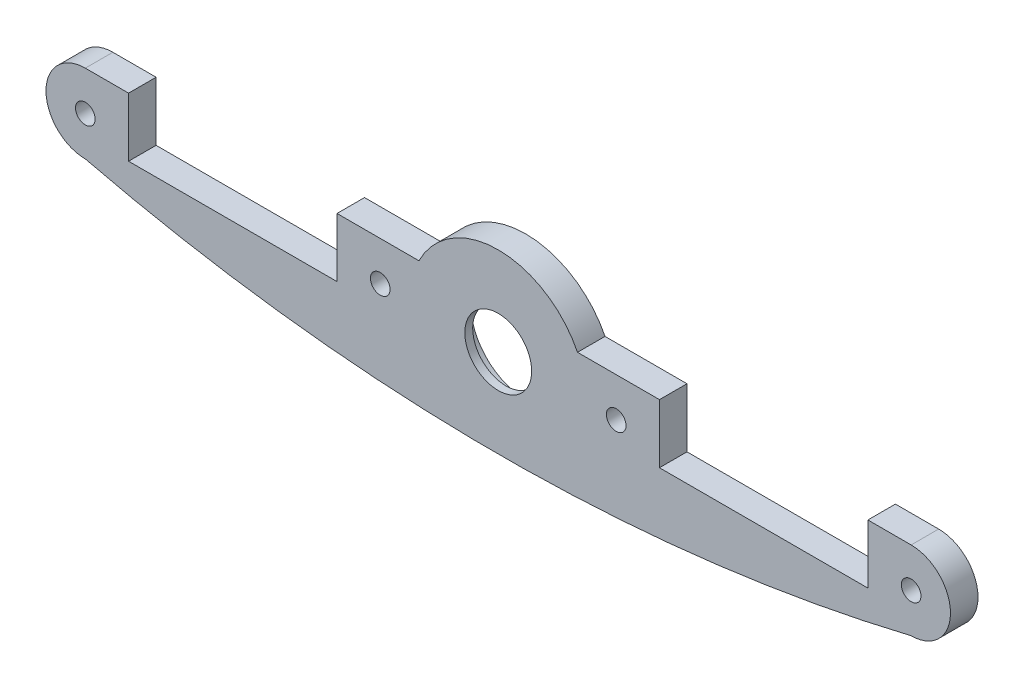
ISO-10303-21;
HEADER;
FILE_DESCRIPTION(('STEP AP214'),'2;1');
FILE_NAME('part.step','',(''),(''),'','','');
FILE_SCHEMA(('AUTOMOTIVE_DESIGN { 1 0 10303 214 1 1 1 1 }'));
ENDSEC;
DATA;
#1=APPLICATION_CONTEXT('core data for automotive mechanical design processes');
#2=APPLICATION_PROTOCOL_DEFINITION('international standard','automotive_design',2000,#1);
#3=PRODUCT_CONTEXT('',#1,'mechanical');
#4=PRODUCT('Part','Part','',(#3));
#5=PRODUCT_RELATED_PRODUCT_CATEGORY('part','',(#4));
#6=PRODUCT_DEFINITION_FORMATION('','',#4);
#7=PRODUCT_DEFINITION_CONTEXT('part definition',#1,'design');
#8=PRODUCT_DEFINITION('design','',#6,#7);
#9=PRODUCT_DEFINITION_SHAPE('','',#8);
#10=(LENGTH_UNIT() NAMED_UNIT(*) SI_UNIT(.MILLI.,.METRE.));
#11=(NAMED_UNIT(*) PLANE_ANGLE_UNIT() SI_UNIT($,.RADIAN.));
#12=(NAMED_UNIT(*) SI_UNIT($,.STERADIAN.) SOLID_ANGLE_UNIT());
#13=UNCERTAINTY_MEASURE_WITH_UNIT(LENGTH_MEASURE(1.E-05),#10,'distance_accuracy_value','');
#14=(GEOMETRIC_REPRESENTATION_CONTEXT(3) GLOBAL_UNCERTAINTY_ASSIGNED_CONTEXT((#13)) GLOBAL_UNIT_ASSIGNED_CONTEXT((#10,
#11,#12)) REPRESENTATION_CONTEXT('',''));
#15=CARTESIAN_POINT('',(0.,0.,0.));
#16=DIRECTION('',(0.,0.,1.));
#17=DIRECTION('',(1.,0.,0.));
#18=AXIS2_PLACEMENT_3D('',#15,#16,#17);
#19=CARTESIAN_POINT('',(0.,10.,-7.));
#20=DIRECTION('',(0.,1.,0.));
#21=DIRECTION('',(-1.,0.,0.));
#22=AXIS2_PLACEMENT_3D('',#19,#20,#21);
#23=PLANE('',#22);
#24=DIRECTION('',(0.,0.,-1.));
#25=VECTOR('',#24,1.);
#26=CARTESIAN_POINT('',(41.,10.,0.00100000000000013));
#27=LINE('',#26,#25);
#28=CARTESIAN_POINT('',(41.,10.,0.));
#29=VERTEX_POINT('',#28);
#30=CARTESIAN_POINT('',(41.,10.,-7.));
#31=VERTEX_POINT('',#30);
#32=EDGE_CURVE('E308',#29,#31,#27,.T.);
#33=ORIENTED_EDGE('',*,*,#32,.T.);
#34=DIRECTION('',(-1.,0.,0.));
#35=VECTOR('',#34,1.);
#36=CARTESIAN_POINT('',(0.,10.,-7.));
#37=LINE('',#36,#35);
#38=CARTESIAN_POINT('',(20.1556443707464,10.,-7.));
#39=VERTEX_POINT('',#38);
#40=EDGE_CURVE('E194',#31,#39,#37,.T.);
#41=ORIENTED_EDGE('',*,*,#40,.T.);
#42=DIRECTION('',(0.,0.,1.));
#43=VECTOR('',#42,1.);
#44=CARTESIAN_POINT('',(20.1556443707464,10.,-7.));
#45=LINE('',#44,#43);
#46=CARTESIAN_POINT('',(20.1556443707464,10.,0.));
#47=VERTEX_POINT('',#46);
#48=EDGE_CURVE('E12',#39,#47,#45,.T.);
#49=ORIENTED_EDGE('',*,*,#48,.T.);
#50=DIRECTION('',(-1.,0.,0.));
#51=VECTOR('',#50,1.);
#52=CARTESIAN_POINT('',(0.,10.,0.));
#53=LINE('',#52,#51);
#54=EDGE_CURVE('E217',#29,#47,#53,.T.);
#55=ORIENTED_EDGE('',*,*,#54,.F.);
#56=EDGE_LOOP('',(#33,#41,#49,#55));
#57=FACE_BOUND('',#56,.T.);
#58=ADVANCED_FACE('F61',(#57),#23,.T.);
#59=CARTESIAN_POINT('',(0.,10.,-7.));
#60=DIRECTION('',(0.,1.,0.));
#61=DIRECTION('',(-1.,0.,0.));
#62=AXIS2_PLACEMENT_3D('',#59,#60,#61);
#63=PLANE('',#62);
#64=DIRECTION('',(0.,0.,-1.));
#65=VECTOR('',#64,1.);
#66=CARTESIAN_POINT('',(-94.,10.,0.00100000000000013));
#67=LINE('',#66,#65);
#68=CARTESIAN_POINT('',(-94.,9.99999999999997,0.));
#69=VERTEX_POINT('',#68);
#70=CARTESIAN_POINT('',(-94.,10.,-7.));
#71=VERTEX_POINT('',#70);
#72=EDGE_CURVE('E297',#69,#71,#67,.T.);
#73=ORIENTED_EDGE('',*,*,#72,.T.);
#74=DIRECTION('',(-1.,0.,0.));
#75=VECTOR('',#74,1.);
#76=CARTESIAN_POINT('',(0.,10.,-7.));
#77=LINE('',#76,#75);
#78=CARTESIAN_POINT('',(-105.,9.99999999999997,-7.));
#79=VERTEX_POINT('',#78);
#80=EDGE_CURVE('E197',#71,#79,#77,.T.);
#81=ORIENTED_EDGE('',*,*,#80,.T.);
#82=DIRECTION('',(0.,0.,1.));
#83=VECTOR('',#82,1.);
#84=CARTESIAN_POINT('',(-105.,9.99999999999997,-7.));
#85=LINE('',#84,#83);
#86=CARTESIAN_POINT('',(-105.,9.99999999999997,0.));
#87=VERTEX_POINT('',#86);
#88=EDGE_CURVE('E187',#79,#87,#85,.T.);
#89=ORIENTED_EDGE('',*,*,#88,.T.);
#90=DIRECTION('',(-1.,0.,0.));
#91=VECTOR('',#90,1.);
#92=CARTESIAN_POINT('',(0.,10.,0.));
#93=LINE('',#92,#91);
#94=EDGE_CURVE('E208',#69,#87,#93,.T.);
#95=ORIENTED_EDGE('',*,*,#94,.F.);
#96=EDGE_LOOP('',(#73,#81,#89,#95));
#97=FACE_BOUND('',#96,.T.);
#98=ADVANCED_FACE('F339',(#97),#63,.T.);
#99=CARTESIAN_POINT('',(0.,0.,-7.));
#100=DIRECTION('',(0.,0.,1.));
#101=DIRECTION('',(1.,0.,0.));
#102=AXIS2_PLACEMENT_3D('',#99,#100,#101);
#103=CYLINDRICAL_SURFACE('',#102,8.5);
#104=CARTESIAN_POINT('',(0.,0.,0.));
#105=DIRECTION('',(0.,0.,1.));
#106=DIRECTION('',(1.,0.,0.));
#107=AXIS2_PLACEMENT_3D('',#104,#105,#106);
#108=CIRCLE('',#107,8.5);
#109=CARTESIAN_POINT('',(8.5,0.,0.));
#110=VERTEX_POINT('',#109);
#111=EDGE_CURVE('E221',#110,#110,#108,.T.);
#112=ORIENTED_EDGE('',*,*,#111,.T.);
#113=EDGE_LOOP('',(#112));
#114=FACE_BOUND('',#113,.T.);
#115=CARTESIAN_POINT('',(0.,0.,-2.));
#116=DIRECTION('',(0.,0.,-1.));
#117=DIRECTION('',(-1.,0.,0.));
#118=AXIS2_PLACEMENT_3D('',#115,#116,#117);
#119=CIRCLE('',#118,8.5);
#120=CARTESIAN_POINT('',(-8.5,0.,-2.));
#121=VERTEX_POINT('',#120);
#122=EDGE_CURVE('E65',#121,#121,#119,.F.);
#123=ORIENTED_EDGE('',*,*,#122,.F.);
#124=EDGE_LOOP('',(#123));
#125=FACE_BOUND('',#124,.T.);
#126=ADVANCED_FACE('F363',(#114,#125),#103,.F.);
#127=CARTESIAN_POINT('',(0.,0.,-7.));
#128=DIRECTION('',(0.,0.,1.));
#129=DIRECTION('',(1.,0.,0.));
#130=AXIS2_PLACEMENT_3D('',#127,#128,#129);
#131=CYLINDRICAL_SURFACE('',#130,22.5);
#132=CARTESIAN_POINT('',(0.,0.,0.));
#133=DIRECTION('',(0.,0.,1.));
#134=DIRECTION('',(1.,0.,0.));
#135=AXIS2_PLACEMENT_3D('',#132,#133,#134);
#136=CIRCLE('',#135,22.5);
#137=CARTESIAN_POINT('',(-20.1556443707464,10.,0.));
#138=VERTEX_POINT('',#137);
#139=EDGE_CURVE('E205',#47,#138,#136,.T.);
#140=ORIENTED_EDGE('',*,*,#139,.F.);
#141=ORIENTED_EDGE('',*,*,#48,.F.);
#142=CARTESIAN_POINT('',(0.,0.,-7.));
#143=DIRECTION('',(0.,0.,1.));
#144=DIRECTION('',(1.,0.,0.));
#145=AXIS2_PLACEMENT_3D('',#142,#143,#144);
#146=CIRCLE('',#145,22.5);
#147=CARTESIAN_POINT('',(-20.1556443707464,10.,-7.));
#148=VERTEX_POINT('',#147);
#149=EDGE_CURVE('E223',#39,#148,#146,.T.);
#150=ORIENTED_EDGE('',*,*,#149,.T.);
#151=DIRECTION('',(0.,0.,1.));
#152=VECTOR('',#151,1.);
#153=CARTESIAN_POINT('',(-20.1556443707464,10.,-7.));
#154=LINE('',#153,#152);
#155=EDGE_CURVE('E204',#148,#138,#154,.T.);
#156=ORIENTED_EDGE('',*,*,#155,.T.);
#157=EDGE_LOOP('',(#140,#141,#150,#156));
#158=FACE_BOUND('',#157,.T.);
#159=ADVANCED_FACE('F63',(#158),#131,.T.);
#160=DIRECTION('',(0.,0.,-1.));
#161=VECTOR('',#160,1.);
#162=CARTESIAN_POINT('',(94.,10.,0.00100000000000013));
#163=LINE('',#162,#161);
#164=CARTESIAN_POINT('',(94.,10.,0.));
#165=VERTEX_POINT('',#164);
#166=CARTESIAN_POINT('',(94.,10.,-7.));
#167=VERTEX_POINT('',#166);
#168=EDGE_CURVE('E309',#165,#167,#163,.T.);
#169=ORIENTED_EDGE('',*,*,#168,.F.);
#170=CARTESIAN_POINT('',(105.,10.,0.));
#171=VERTEX_POINT('',#170);
#172=EDGE_CURVE('E218',#171,#165,#53,.T.);
#173=ORIENTED_EDGE('',*,*,#172,.F.);
#174=DIRECTION('',(0.,0.,1.));
#175=VECTOR('',#174,1.);
#176=CARTESIAN_POINT('',(105.,10.,-7.));
#177=LINE('',#176,#175);
#178=CARTESIAN_POINT('',(105.,10.,-7.));
#179=VERTEX_POINT('',#178);
#180=EDGE_CURVE('E70',#179,#171,#177,.T.);
#181=ORIENTED_EDGE('',*,*,#180,.F.);
#182=EDGE_CURVE('E201',#179,#167,#37,.T.);
#183=ORIENTED_EDGE('',*,*,#182,.T.);
#184=EDGE_LOOP('',(#169,#173,#181,#183));
#185=FACE_BOUND('',#184,.T.);
#186=ADVANCED_FACE('F333',(#185),#23,.T.);
#187=CARTESIAN_POINT('',(105.,0.,-7.));
#188=DIRECTION('',(0.,0.,1.));
#189=DIRECTION('',(1.,0.,0.));
#190=AXIS2_PLACEMENT_3D('',#187,#188,#189);
#191=CYLINDRICAL_SURFACE('',#190,10.);
#192=CARTESIAN_POINT('',(105.,0.,0.));
#193=DIRECTION('',(0.,0.,1.));
#194=DIRECTION('',(1.,0.,0.));
#195=AXIS2_PLACEMENT_3D('',#192,#193,#194);
#196=CIRCLE('',#195,10.);
#197=CARTESIAN_POINT('',(105.,-9.99999999999996,0.));
#198=VERTEX_POINT('',#197);
#199=EDGE_CURVE('E214',#198,#171,#196,.T.);
#200=ORIENTED_EDGE('',*,*,#199,.F.);
#201=DIRECTION('',(0.,0.,1.));
#202=VECTOR('',#201,1.);
#203=CARTESIAN_POINT('',(105.,-9.99999999999996,-7.));
#204=LINE('',#203,#202);
#205=CARTESIAN_POINT('',(105.,-9.99999999999996,-7.));
#206=VERTEX_POINT('',#205);
#207=EDGE_CURVE('E186',#206,#198,#204,.T.);
#208=ORIENTED_EDGE('',*,*,#207,.F.);
#209=CARTESIAN_POINT('',(105.,0.,-7.));
#210=DIRECTION('',(0.,0.,1.));
#211=DIRECTION('',(1.,0.,0.));
#212=AXIS2_PLACEMENT_3D('',#209,#210,#211);
#213=CIRCLE('',#212,10.);
#214=EDGE_CURVE('E174',#206,#179,#213,.T.);
#215=ORIENTED_EDGE('',*,*,#214,.T.);
#216=ORIENTED_EDGE('',*,*,#180,.T.);
#217=EDGE_LOOP('',(#200,#208,#215,#216));
#218=FACE_BOUND('',#217,.T.);
#219=ADVANCED_FACE('F336',(#218),#191,.T.);
#220=CARTESIAN_POINT('',(-105.,0.,-7.));
#221=DIRECTION('',(0.,0.,1.));
#222=DIRECTION('',(1.,0.,0.));
#223=AXIS2_PLACEMENT_3D('',#220,#221,#222);
#224=CYLINDRICAL_SURFACE('',#223,10.);
#225=CARTESIAN_POINT('',(-105.,0.,0.));
#226=DIRECTION('',(0.,0.,1.));
#227=DIRECTION('',(1.,0.,0.));
#228=AXIS2_PLACEMENT_3D('',#225,#226,#227);
#229=CIRCLE('',#228,10.);
#230=CARTESIAN_POINT('',(-105.,-10.,0.));
#231=VERTEX_POINT('',#230);
#232=EDGE_CURVE('E212',#87,#231,#229,.T.);
#233=ORIENTED_EDGE('',*,*,#232,.F.);
#234=ORIENTED_EDGE('',*,*,#88,.F.);
#235=CARTESIAN_POINT('',(-105.,0.,-7.));
#236=DIRECTION('',(0.,0.,1.));
#237=DIRECTION('',(1.,0.,0.));
#238=AXIS2_PLACEMENT_3D('',#235,#236,#237);
#239=CIRCLE('',#238,10.);
#240=CARTESIAN_POINT('',(-105.,-10.,-7.));
#241=VERTEX_POINT('',#240);
#242=EDGE_CURVE('E171',#79,#241,#239,.T.);
#243=ORIENTED_EDGE('',*,*,#242,.T.);
#244=DIRECTION('',(0.,0.,1.));
#245=VECTOR('',#244,1.);
#246=CARTESIAN_POINT('',(-105.,-10.,-7.));
#247=LINE('',#246,#245);
#248=EDGE_CURVE('E180',#241,#231,#247,.T.);
#249=ORIENTED_EDGE('',*,*,#248,.T.);
#250=EDGE_LOOP('',(#233,#234,#243,#249));
#251=FACE_BOUND('',#250,.T.);
#252=ADVANCED_FACE('F190',(#251),#224,.T.);
#253=DIRECTION('',(0.,0.,-1.));
#254=VECTOR('',#253,1.);
#255=CARTESIAN_POINT('',(-41.,10.,0.00100000000000013));
#256=LINE('',#255,#254);
#257=CARTESIAN_POINT('',(-41.,9.99999999999999,0.));
#258=VERTEX_POINT('',#257);
#259=CARTESIAN_POINT('',(-41.,10.,-7.));
#260=VERTEX_POINT('',#259);
#261=EDGE_CURVE('E237',#258,#260,#256,.T.);
#262=ORIENTED_EDGE('',*,*,#261,.F.);
#263=EDGE_CURVE('E209',#138,#258,#93,.T.);
#264=ORIENTED_EDGE('',*,*,#263,.F.);
#265=ORIENTED_EDGE('',*,*,#155,.F.);
#266=EDGE_CURVE('E192',#148,#260,#77,.T.);
#267=ORIENTED_EDGE('',*,*,#266,.T.);
#268=EDGE_LOOP('',(#262,#264,#265,#267));
#269=FACE_BOUND('',#268,.T.);
#270=ADVANCED_FACE('F236',(#269),#63,.T.);
#271=CARTESIAN_POINT('',(0.,0.,-7.));
#272=DIRECTION('',(0.,0.,1.));
#273=DIRECTION('',(1.,0.,0.));
#274=AXIS2_PLACEMENT_3D('',#271,#272,#273);
#275=PLANE('',#274);
#276=CARTESIAN_POINT('',(-7.21644966006352E-13,424.750000000005,-7.));
#277=DIRECTION('',(0.,0.,-1.));
#278=DIRECTION('',(-1.,0.,0.));
#279=AXIS2_PLACEMENT_3D('',#276,#277,#278);
#280=CIRCLE('',#279,447.250000000005);
#281=EDGE_CURVE('E165',#206,#241,#280,.T.);
#282=ORIENTED_EDGE('',*,*,#281,.T.);
#283=ORIENTED_EDGE('',*,*,#242,.F.);
#284=ORIENTED_EDGE('',*,*,#80,.F.);
#285=DIRECTION('',(0.,1.,0.));
#286=VECTOR('',#285,1.);
#287=CARTESIAN_POINT('',(-94.,10.,-7.));
#288=LINE('',#287,#286);
#289=CARTESIAN_POINT('',(-94.,-4.99999999999996,-7.));
#290=VERTEX_POINT('',#289);
#291=EDGE_CURVE('E295',#290,#71,#288,.T.);
#292=ORIENTED_EDGE('',*,*,#291,.F.);
#293=DIRECTION('',(-1.,0.,0.));
#294=VECTOR('',#293,1.);
#295=CARTESIAN_POINT('',(-94.,-4.99999999999996,-7.));
#296=LINE('',#295,#294);
#297=CARTESIAN_POINT('',(-41.,-4.99999999999996,-7.));
#298=VERTEX_POINT('',#297);
#299=EDGE_CURVE('E292',#298,#290,#296,.T.);
#300=ORIENTED_EDGE('',*,*,#299,.F.);
#301=DIRECTION('',(0.,-1.,0.));
#302=VECTOR('',#301,1.);
#303=CARTESIAN_POINT('',(-41.,-4.99999999999996,-7.));
#304=LINE('',#303,#302);
#305=EDGE_CURVE('E290',#260,#298,#304,.T.);
#306=ORIENTED_EDGE('',*,*,#305,.F.);
#307=ORIENTED_EDGE('',*,*,#266,.F.);
#308=ORIENTED_EDGE('',*,*,#149,.F.);
#309=ORIENTED_EDGE('',*,*,#40,.F.);
#310=DIRECTION('',(0.,1.,0.));
#311=VECTOR('',#310,1.);
#312=CARTESIAN_POINT('',(41.,-4.99999999999996,-7.));
#313=LINE('',#312,#311);
#314=CARTESIAN_POINT('',(41.,-4.99999999999996,-7.));
#315=VERTEX_POINT('',#314);
#316=EDGE_CURVE('E311',#315,#31,#313,.T.);
#317=ORIENTED_EDGE('',*,*,#316,.F.);
#318=DIRECTION('',(-1.,0.,0.));
#319=VECTOR('',#318,1.);
#320=CARTESIAN_POINT('',(94.,-4.99999999999996,-7.));
#321=LINE('',#320,#319);
#322=CARTESIAN_POINT('',(94.,-4.99999999999996,-7.));
#323=VERTEX_POINT('',#322);
#324=EDGE_CURVE('E317',#323,#315,#321,.T.);
#325=ORIENTED_EDGE('',*,*,#324,.F.);
#326=DIRECTION('',(0.,-1.,0.));
#327=VECTOR('',#326,1.);
#328=CARTESIAN_POINT('',(94.,10.,-7.));
#329=LINE('',#328,#327);
#330=EDGE_CURVE('E320',#167,#323,#329,.T.);
#331=ORIENTED_EDGE('',*,*,#330,.F.);
#332=ORIENTED_EDGE('',*,*,#182,.F.);
#333=ORIENTED_EDGE('',*,*,#214,.F.);
#334=EDGE_LOOP('',(#282,#283,#284,#292,#300,#306,#307,#308,#309,#317,#325,#331,#332,#333));
#335=FACE_BOUND('',#334,.T.);
#336=CARTESIAN_POINT('',(105.,0.,-7.));
#337=DIRECTION('',(0.,0.,1.));
#338=DIRECTION('',(1.,0.,0.));
#339=AXIS2_PLACEMENT_3D('',#336,#337,#338);
#340=CIRCLE('',#339,2.49999999999998);
#341=CARTESIAN_POINT('',(107.5,0.,-7.));
#342=VERTEX_POINT('',#341);
#343=EDGE_CURVE('E264',#342,#342,#340,.T.);
#344=ORIENTED_EDGE('',*,*,#343,.T.);
#345=EDGE_LOOP('',(#344));
#346=FACE_BOUND('',#345,.T.);
#347=CARTESIAN_POINT('',(-105.,0.,-7.));
#348=DIRECTION('',(0.,0.,1.));
#349=DIRECTION('',(-1.,0.,0.));
#350=AXIS2_PLACEMENT_3D('',#347,#348,#349);
#351=CIRCLE('',#350,2.49999999999998);
#352=CARTESIAN_POINT('',(-107.5,0.,-7.));
#353=VERTEX_POINT('',#352);
#354=EDGE_CURVE('E265',#353,#353,#351,.T.);
#355=ORIENTED_EDGE('',*,*,#354,.T.);
#356=EDGE_LOOP('',(#355));
#357=FACE_BOUND('',#356,.T.);
#358=CARTESIAN_POINT('',(-30.,0.,-7.));
#359=DIRECTION('',(0.,0.,1.));
#360=DIRECTION('',(-1.,0.,0.));
#361=AXIS2_PLACEMENT_3D('',#358,#359,#360);
#362=CIRCLE('',#361,2.5);
#363=CARTESIAN_POINT('',(-32.5,0.,-7.));
#364=VERTEX_POINT('',#363);
#365=EDGE_CURVE('E272',#364,#364,#362,.T.);
#366=ORIENTED_EDGE('',*,*,#365,.T.);
#367=EDGE_LOOP('',(#366));
#368=FACE_BOUND('',#367,.T.);
#369=CARTESIAN_POINT('',(30.,0.,-7.));
#370=DIRECTION('',(0.,0.,1.));
#371=DIRECTION('',(1.,0.,0.));
#372=AXIS2_PLACEMENT_3D('',#369,#370,#371);
#373=CIRCLE('',#372,2.5);
#374=CARTESIAN_POINT('',(32.5,0.,-7.));
#375=VERTEX_POINT('',#374);
#376=EDGE_CURVE('E261',#375,#375,#373,.T.);
#377=ORIENTED_EDGE('',*,*,#376,.T.);
#378=EDGE_LOOP('',(#377));
#379=FACE_BOUND('',#378,.T.);
#380=CARTESIAN_POINT('',(0.,0.,-7.));
#381=DIRECTION('',(0.,0.,-1.));
#382=DIRECTION('',(-1.,0.,0.));
#383=AXIS2_PLACEMENT_3D('',#380,#381,#382);
#384=CIRCLE('',#383,14.);
#385=CARTESIAN_POINT('',(-14.,0.,-7.));
#386=VERTEX_POINT('',#385);
#387=EDGE_CURVE('E252',#386,#386,#384,.T.);
#388=ORIENTED_EDGE('',*,*,#387,.F.);
#389=EDGE_LOOP('',(#388));
#390=FACE_BOUND('',#389,.T.);
#391=ADVANCED_FACE('F167',(#335,#346,#357,#368,#379,#390),#275,.F.);
#392=CARTESIAN_POINT('',(0.,0.,0.));
#393=DIRECTION('',(0.,0.,1.));
#394=DIRECTION('',(1.,0.,0.));
#395=AXIS2_PLACEMENT_3D('',#392,#393,#394);
#396=PLANE('',#395);
#397=ORIENTED_EDGE('',*,*,#232,.T.);
#398=CARTESIAN_POINT('',(-7.21644966006352E-13,424.750000000005,0.));
#399=DIRECTION('',(0.,0.,1.));
#400=DIRECTION('',(1.,0.,0.));
#401=AXIS2_PLACEMENT_3D('',#398,#399,#400);
#402=CIRCLE('',#401,447.250000000005);
#403=EDGE_CURVE('E177',#198,#231,#402,.F.);
#404=ORIENTED_EDGE('',*,*,#403,.F.);
#405=ORIENTED_EDGE('',*,*,#199,.T.);
#406=ORIENTED_EDGE('',*,*,#172,.T.);
#407=DIRECTION('',(0.,-1.,0.));
#408=VECTOR('',#407,1.);
#409=CARTESIAN_POINT('',(94.,10.,0.));
#410=LINE('',#409,#408);
#411=CARTESIAN_POINT('',(94.,-4.99999999999996,0.));
#412=VERTEX_POINT('',#411);
#413=EDGE_CURVE('E282',#165,#412,#410,.T.);
#414=ORIENTED_EDGE('',*,*,#413,.T.);
#415=DIRECTION('',(-1.,0.,0.));
#416=VECTOR('',#415,1.);
#417=CARTESIAN_POINT('',(94.,-4.99999999999996,0.));
#418=LINE('',#417,#416);
#419=CARTESIAN_POINT('',(41.,-4.99999999999996,0.));
#420=VERTEX_POINT('',#419);
#421=EDGE_CURVE('E286',#412,#420,#418,.T.);
#422=ORIENTED_EDGE('',*,*,#421,.T.);
#423=DIRECTION('',(0.,1.,0.));
#424=VECTOR('',#423,1.);
#425=CARTESIAN_POINT('',(41.,-4.99999999999996,0.));
#426=LINE('',#425,#424);
#427=EDGE_CURVE('E245',#420,#29,#426,.T.);
#428=ORIENTED_EDGE('',*,*,#427,.T.);
#429=ORIENTED_EDGE('',*,*,#54,.T.);
#430=ORIENTED_EDGE('',*,*,#139,.T.);
#431=ORIENTED_EDGE('',*,*,#263,.T.);
#432=DIRECTION('',(0.,-1.,0.));
#433=VECTOR('',#432,1.);
#434=CARTESIAN_POINT('',(-41.,-4.99999999999996,0.));
#435=LINE('',#434,#433);
#436=CARTESIAN_POINT('',(-41.,-4.99999999999996,0.));
#437=VERTEX_POINT('',#436);
#438=EDGE_CURVE('E301',#258,#437,#435,.T.);
#439=ORIENTED_EDGE('',*,*,#438,.T.);
#440=DIRECTION('',(-1.,0.,0.));
#441=VECTOR('',#440,1.);
#442=CARTESIAN_POINT('',(-94.,-4.99999999999996,0.));
#443=LINE('',#442,#441);
#444=CARTESIAN_POINT('',(-94.,-4.99999999999996,0.));
#445=VERTEX_POINT('',#444);
#446=EDGE_CURVE('E283',#437,#445,#443,.T.);
#447=ORIENTED_EDGE('',*,*,#446,.T.);
#448=DIRECTION('',(0.,1.,0.));
#449=VECTOR('',#448,1.);
#450=CARTESIAN_POINT('',(-94.,10.,0.));
#451=LINE('',#450,#449);
#452=EDGE_CURVE('E287',#445,#69,#451,.T.);
#453=ORIENTED_EDGE('',*,*,#452,.T.);
#454=ORIENTED_EDGE('',*,*,#94,.T.);
#455=EDGE_LOOP('',(#397,#404,#405,#406,#414,#422,#428,#429,#430,#431,#439,#447,#453,#454));
#456=FACE_BOUND('',#455,.T.);
#457=CARTESIAN_POINT('',(105.,0.,0.));
#458=DIRECTION('',(0.,0.,1.));
#459=DIRECTION('',(1.,0.,0.));
#460=AXIS2_PLACEMENT_3D('',#457,#458,#459);
#461=CIRCLE('',#460,2.49999999999998);
#462=CARTESIAN_POINT('',(107.5,0.,0.));
#463=VERTEX_POINT('',#462);
#464=EDGE_CURVE('E268',#463,#463,#461,.T.);
#465=ORIENTED_EDGE('',*,*,#464,.F.);
#466=EDGE_LOOP('',(#465));
#467=FACE_BOUND('',#466,.T.);
#468=CARTESIAN_POINT('',(-105.,0.,0.));
#469=DIRECTION('',(0.,0.,1.));
#470=DIRECTION('',(1.,0.,0.));
#471=AXIS2_PLACEMENT_3D('',#468,#469,#470);
#472=CIRCLE('',#471,2.49999999999998);
#473=CARTESIAN_POINT('',(-102.5,0.,0.));
#474=VERTEX_POINT('',#473);
#475=EDGE_CURVE('E269',#474,#474,#472,.T.);
#476=ORIENTED_EDGE('',*,*,#475,.F.);
#477=EDGE_LOOP('',(#476));
#478=FACE_BOUND('',#477,.T.);
#479=CARTESIAN_POINT('',(-30.,0.,0.));
#480=DIRECTION('',(0.,0.,1.));
#481=DIRECTION('',(1.,0.,0.));
#482=AXIS2_PLACEMENT_3D('',#479,#480,#481);
#483=CIRCLE('',#482,2.5);
#484=CARTESIAN_POINT('',(-27.5,0.,0.));
#485=VERTEX_POINT('',#484);
#486=EDGE_CURVE('E279',#485,#485,#483,.T.);
#487=ORIENTED_EDGE('',*,*,#486,.F.);
#488=EDGE_LOOP('',(#487));
#489=FACE_BOUND('',#488,.T.);
#490=CARTESIAN_POINT('',(30.,0.,0.));
#491=DIRECTION('',(0.,0.,1.));
#492=DIRECTION('',(1.,0.,0.));
#493=AXIS2_PLACEMENT_3D('',#490,#491,#492);
#494=CIRCLE('',#493,2.5);
#495=CARTESIAN_POINT('',(32.5,0.,0.));
#496=VERTEX_POINT('',#495);
#497=EDGE_CURVE('E256',#496,#496,#494,.T.);
#498=ORIENTED_EDGE('',*,*,#497,.F.);
#499=EDGE_LOOP('',(#498));
#500=FACE_BOUND('',#499,.T.);
#501=ORIENTED_EDGE('',*,*,#111,.F.);
#502=EDGE_LOOP('',(#501));
#503=FACE_BOUND('',#502,.T.);
#504=ADVANCED_FACE('F240',(#456,#467,#478,#489,#500,#503),#396,.T.);
#505=CARTESIAN_POINT('',(0.,0.,-2.));
#506=DIRECTION('',(0.,0.,-1.));
#507=DIRECTION('',(-1.,0.,0.));
#508=AXIS2_PLACEMENT_3D('',#505,#506,#507);
#509=PLANE('',#508);
#510=CARTESIAN_POINT('',(0.,0.,-2.));
#511=DIRECTION('',(0.,0.,-1.));
#512=DIRECTION('',(-1.,0.,0.));
#513=AXIS2_PLACEMENT_3D('',#510,#511,#512);
#514=CIRCLE('',#513,14.);
#515=CARTESIAN_POINT('',(-14.,0.,-2.));
#516=VERTEX_POINT('',#515);
#517=EDGE_CURVE('E255',#516,#516,#514,.T.);
#518=ORIENTED_EDGE('',*,*,#517,.T.);
#519=EDGE_LOOP('',(#518));
#520=FACE_BOUND('',#519,.T.);
#521=ORIENTED_EDGE('',*,*,#122,.T.);
#522=EDGE_LOOP('',(#521));
#523=FACE_BOUND('',#522,.T.);
#524=ADVANCED_FACE('F383',(#520,#523),#509,.T.);
#525=CARTESIAN_POINT('',(0.,0.,-2.));
#526=DIRECTION('',(0.,0.,-1.));
#527=DIRECTION('',(-1.,0.,0.));
#528=AXIS2_PLACEMENT_3D('',#525,#526,#527);
#529=CYLINDRICAL_SURFACE('',#528,14.);
#530=ORIENTED_EDGE('',*,*,#517,.F.);
#531=EDGE_LOOP('',(#530));
#532=FACE_BOUND('',#531,.T.);
#533=ORIENTED_EDGE('',*,*,#387,.T.);
#534=EDGE_LOOP('',(#533));
#535=FACE_BOUND('',#534,.T.);
#536=ADVANCED_FACE('F386',(#532,#535),#529,.F.);
#537=CARTESIAN_POINT('',(30.,0.,0.00100000000000013));
#538=DIRECTION('',(0.,0.,-1.));
#539=DIRECTION('',(-1.,0.,0.));
#540=AXIS2_PLACEMENT_3D('',#537,#538,#539);
#541=CYLINDRICAL_SURFACE('',#540,2.5);
#542=ORIENTED_EDGE('',*,*,#497,.T.);
#543=EDGE_LOOP('',(#542));
#544=FACE_BOUND('',#543,.T.);
#545=ORIENTED_EDGE('',*,*,#376,.F.);
#546=EDGE_LOOP('',(#545));
#547=FACE_BOUND('',#546,.T.);
#548=ADVANCED_FACE('F389',(#544,#547),#541,.F.);
#549=CARTESIAN_POINT('',(-30.,0.,0.00100000000000013));
#550=DIRECTION('',(0.,0.,-1.));
#551=DIRECTION('',(-1.,0.,0.));
#552=AXIS2_PLACEMENT_3D('',#549,#550,#551);
#553=CYLINDRICAL_SURFACE('',#552,2.5);
#554=ORIENTED_EDGE('',*,*,#486,.T.);
#555=EDGE_LOOP('',(#554));
#556=FACE_BOUND('',#555,.T.);
#557=ORIENTED_EDGE('',*,*,#365,.F.);
#558=EDGE_LOOP('',(#557));
#559=FACE_BOUND('',#558,.T.);
#560=ADVANCED_FACE('F395',(#556,#559),#553,.F.);
#561=CARTESIAN_POINT('',(-105.,0.,0.00100000000000013));
#562=DIRECTION('',(0.,0.,-1.));
#563=DIRECTION('',(-1.,0.,0.));
#564=AXIS2_PLACEMENT_3D('',#561,#562,#563);
#565=CYLINDRICAL_SURFACE('',#564,2.49999999999998);
#566=ORIENTED_EDGE('',*,*,#475,.T.);
#567=EDGE_LOOP('',(#566));
#568=FACE_BOUND('',#567,.T.);
#569=ORIENTED_EDGE('',*,*,#354,.F.);
#570=EDGE_LOOP('',(#569));
#571=FACE_BOUND('',#570,.T.);
#572=ADVANCED_FACE('F397',(#568,#571),#565,.F.);
#573=CARTESIAN_POINT('',(105.,0.,0.00100000000000013));
#574=DIRECTION('',(0.,0.,-1.));
#575=DIRECTION('',(-1.,0.,0.));
#576=AXIS2_PLACEMENT_3D('',#573,#574,#575);
#577=CYLINDRICAL_SURFACE('',#576,2.49999999999998);
#578=ORIENTED_EDGE('',*,*,#464,.T.);
#579=EDGE_LOOP('',(#578));
#580=FACE_BOUND('',#579,.T.);
#581=ORIENTED_EDGE('',*,*,#343,.F.);
#582=EDGE_LOOP('',(#581));
#583=FACE_BOUND('',#582,.T.);
#584=ADVANCED_FACE('F400',(#580,#583),#577,.F.);
#585=CARTESIAN_POINT('',(-94.,10.,0.00100000000000013));
#586=DIRECTION('',(-1.,0.,0.));
#587=DIRECTION('',(0.,-1.,0.));
#588=AXIS2_PLACEMENT_3D('',#585,#586,#587);
#589=PLANE('',#588);
#590=DIRECTION('',(0.,0.,-1.));
#591=VECTOR('',#590,1.);
#592=CARTESIAN_POINT('',(-94.,-4.99999999999996,0.00100000000000013));
#593=LINE('',#592,#591);
#594=EDGE_CURVE('E300',#445,#290,#593,.T.);
#595=ORIENTED_EDGE('',*,*,#594,.T.);
#596=ORIENTED_EDGE('',*,*,#291,.T.);
#597=ORIENTED_EDGE('',*,*,#72,.F.);
#598=ORIENTED_EDGE('',*,*,#452,.F.);
#599=EDGE_LOOP('',(#595,#596,#597,#598));
#600=FACE_BOUND('',#599,.T.);
#601=ADVANCED_FACE('F343',(#600),#589,.F.);
#602=CARTESIAN_POINT('',(-94.,-4.99999999999996,0.00100000000000013));
#603=DIRECTION('',(0.,-1.,0.));
#604=DIRECTION('',(0.,0.,-1.));
#605=AXIS2_PLACEMENT_3D('',#602,#603,#604);
#606=PLANE('',#605);
#607=DIRECTION('',(0.,0.,-1.));
#608=VECTOR('',#607,1.);
#609=CARTESIAN_POINT('',(-41.,-4.99999999999996,0.00100000000000013));
#610=LINE('',#609,#608);
#611=EDGE_CURVE('E86',#437,#298,#610,.T.);
#612=ORIENTED_EDGE('',*,*,#611,.T.);
#613=ORIENTED_EDGE('',*,*,#299,.T.);
#614=ORIENTED_EDGE('',*,*,#594,.F.);
#615=ORIENTED_EDGE('',*,*,#446,.F.);
#616=EDGE_LOOP('',(#612,#613,#614,#615));
#617=FACE_BOUND('',#616,.T.);
#618=ADVANCED_FACE('F346',(#617),#606,.F.);
#619=CARTESIAN_POINT('',(-41.,-4.99999999999996,0.00100000000000013));
#620=DIRECTION('',(1.,0.,0.));
#621=DIRECTION('',(0.,0.,-1.));
#622=AXIS2_PLACEMENT_3D('',#619,#620,#621);
#623=PLANE('',#622);
#624=ORIENTED_EDGE('',*,*,#261,.T.);
#625=ORIENTED_EDGE('',*,*,#305,.T.);
#626=ORIENTED_EDGE('',*,*,#611,.F.);
#627=ORIENTED_EDGE('',*,*,#438,.F.);
#628=EDGE_LOOP('',(#624,#625,#626,#627));
#629=FACE_BOUND('',#628,.T.);
#630=ADVANCED_FACE('F347',(#629),#623,.F.);
#631=CARTESIAN_POINT('',(41.,-4.99999999999996,0.00100000000000013));
#632=DIRECTION('',(-1.,0.,0.));
#633=DIRECTION('',(0.,0.,1.));
#634=AXIS2_PLACEMENT_3D('',#631,#632,#633);
#635=PLANE('',#634);
#636=DIRECTION('',(0.,0.,-1.));
#637=VECTOR('',#636,1.);
#638=CARTESIAN_POINT('',(41.,-4.99999999999996,0.00100000000000013));
#639=LINE('',#638,#637);
#640=EDGE_CURVE('E313',#420,#315,#639,.T.);
#641=ORIENTED_EDGE('',*,*,#640,.T.);
#642=ORIENTED_EDGE('',*,*,#316,.T.);
#643=ORIENTED_EDGE('',*,*,#32,.F.);
#644=ORIENTED_EDGE('',*,*,#427,.F.);
#645=EDGE_LOOP('',(#641,#642,#643,#644));
#646=FACE_BOUND('',#645,.T.);
#647=ADVANCED_FACE('F329',(#646),#635,.F.);
#648=CARTESIAN_POINT('',(94.,-4.99999999999996,0.00100000000000013));
#649=DIRECTION('',(0.,-1.,0.));
#650=DIRECTION('',(0.,0.,-1.));
#651=AXIS2_PLACEMENT_3D('',#648,#649,#650);
#652=PLANE('',#651);
#653=DIRECTION('',(0.,0.,-1.));
#654=VECTOR('',#653,1.);
#655=CARTESIAN_POINT('',(94.,-4.99999999999996,0.00100000000000013));
#656=LINE('',#655,#654);
#657=EDGE_CURVE('E78',#412,#323,#656,.T.);
#658=ORIENTED_EDGE('',*,*,#657,.T.);
#659=ORIENTED_EDGE('',*,*,#324,.T.);
#660=ORIENTED_EDGE('',*,*,#640,.F.);
#661=ORIENTED_EDGE('',*,*,#421,.F.);
#662=EDGE_LOOP('',(#658,#659,#660,#661));
#663=FACE_BOUND('',#662,.T.);
#664=ADVANCED_FACE('F326',(#663),#652,.F.);
#665=CARTESIAN_POINT('',(94.,10.,0.00100000000000013));
#666=DIRECTION('',(1.,0.,0.));
#667=DIRECTION('',(0.,1.,0.));
#668=AXIS2_PLACEMENT_3D('',#665,#666,#667);
#669=PLANE('',#668);
#670=ORIENTED_EDGE('',*,*,#168,.T.);
#671=ORIENTED_EDGE('',*,*,#330,.T.);
#672=ORIENTED_EDGE('',*,*,#657,.F.);
#673=ORIENTED_EDGE('',*,*,#413,.F.);
#674=EDGE_LOOP('',(#670,#671,#672,#673));
#675=FACE_BOUND('',#674,.T.);
#676=ADVANCED_FACE('F438',(#675),#669,.F.);
#677=CARTESIAN_POINT('',(-7.21644966006352E-13,424.750000000005,105.741429912783));
#678=DIRECTION('',(0.,0.,-1.));
#679=DIRECTION('',(-1.,0.,0.));
#680=AXIS2_PLACEMENT_3D('',#677,#678,#679);
#681=CYLINDRICAL_SURFACE('',#680,447.250000000005);
#682=ORIENTED_EDGE('',*,*,#207,.T.);
#683=ORIENTED_EDGE('',*,*,#403,.T.);
#684=ORIENTED_EDGE('',*,*,#248,.F.);
#685=ORIENTED_EDGE('',*,*,#281,.F.);
#686=EDGE_LOOP('',(#682,#683,#684,#685));
#687=FACE_BOUND('',#686,.T.);
#688=ADVANCED_FACE('F181',(#687),#681,.T.);
#689=CLOSED_SHELL('',(#58,#98,#126,#159,#186,#219,#252,#270,#391,#504,#524,#536,#548,#560,#572,
#584,#601,#618,#630,#647,#664,#676,#688));
#690=MANIFOLD_SOLID_BREP('B2',#689);
#691=ADVANCED_BREP_SHAPE_REPRESENTATION('',(#18,#690),#14);
#692=SHAPE_DEFINITION_REPRESENTATION(#9,#691);
ENDSEC;
END-ISO-10303-21;
